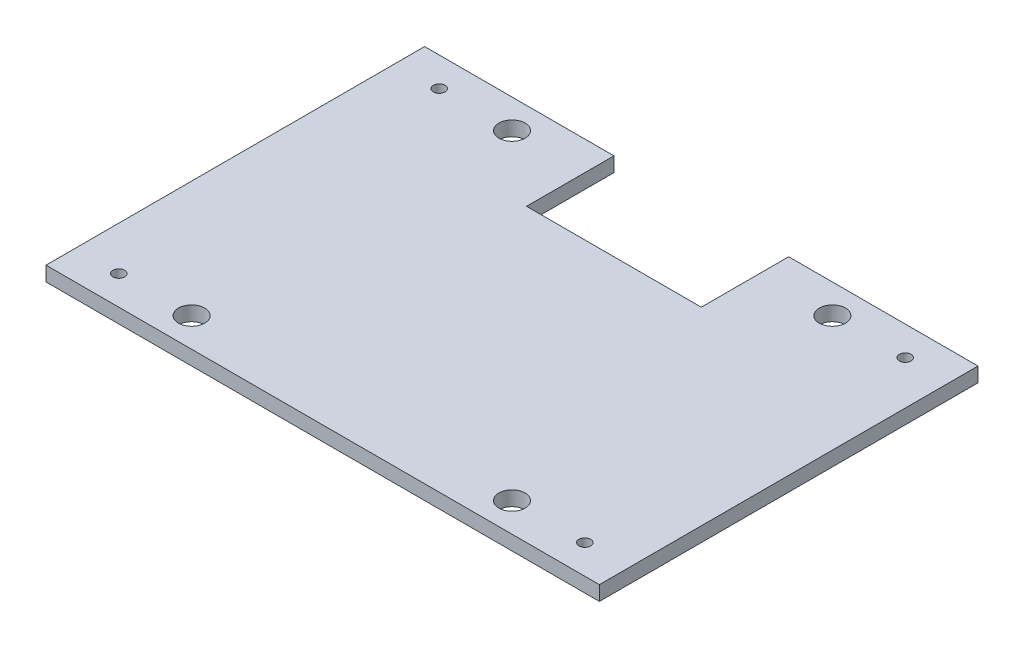
ISO-10303-21;
HEADER;
FILE_DESCRIPTION(('STEP AP214'),'2;1');
FILE_NAME('part.step','',(''),(''),'','','');
FILE_SCHEMA(('AUTOMOTIVE_DESIGN { 1 0 10303 214 1 1 1 1 }'));
ENDSEC;
DATA;
#1=APPLICATION_CONTEXT('core data for automotive mechanical design processes');
#2=APPLICATION_PROTOCOL_DEFINITION('international standard','automotive_design',2000,#1);
#3=PRODUCT_CONTEXT('',#1,'mechanical');
#4=PRODUCT('Part','Part','',(#3));
#5=PRODUCT_RELATED_PRODUCT_CATEGORY('part','',(#4));
#6=PRODUCT_DEFINITION_FORMATION('','',#4);
#7=PRODUCT_DEFINITION_CONTEXT('part definition',#1,'design');
#8=PRODUCT_DEFINITION('design','',#6,#7);
#9=PRODUCT_DEFINITION_SHAPE('','',#8);
#10=(LENGTH_UNIT() NAMED_UNIT(*) SI_UNIT(.MILLI.,.METRE.));
#11=(NAMED_UNIT(*) PLANE_ANGLE_UNIT() SI_UNIT($,.RADIAN.));
#12=(NAMED_UNIT(*) SI_UNIT($,.STERADIAN.) SOLID_ANGLE_UNIT());
#13=UNCERTAINTY_MEASURE_WITH_UNIT(LENGTH_MEASURE(1.E-05),#10,'distance_accuracy_value','');
#14=(GEOMETRIC_REPRESENTATION_CONTEXT(3) GLOBAL_UNCERTAINTY_ASSIGNED_CONTEXT((#13)) GLOBAL_UNIT_ASSIGNED_CONTEXT((#10,
#11,#12)) REPRESENTATION_CONTEXT('',''));
#15=CARTESIAN_POINT('',(0.,0.,0.));
#16=DIRECTION('',(0.,0.,1.));
#17=DIRECTION('',(1.,0.,0.));
#18=AXIS2_PLACEMENT_3D('',#15,#16,#17);
#19=CARTESIAN_POINT('',(0.,5.,0.));
#20=DIRECTION('',(0.,1.,0.));
#21=DIRECTION('',(0.,0.,1.));
#22=AXIS2_PLACEMENT_3D('',#19,#20,#21);
#23=PLANE('',#22);
#24=CARTESIAN_POINT('',(80.,5.,55.));
#25=DIRECTION('',(0.,1.,0.));
#26=DIRECTION('',(0.,0.,1.));
#27=AXIS2_PLACEMENT_3D('',#24,#25,#26);
#28=CIRCLE('',#27,2.);
#29=CARTESIAN_POINT('',(80.,5.,57.));
#30=VERTEX_POINT('',#29);
#31=EDGE_CURVE('E213',#30,#30,#28,.T.);
#32=ORIENTED_EDGE('',*,*,#31,.F.);
#33=EDGE_LOOP('',(#32));
#34=FACE_BOUND('',#33,.T.);
#35=CARTESIAN_POINT('',(-80.,5.,-55.));
#36=DIRECTION('',(0.,1.,0.));
#37=DIRECTION('',(0.,0.,1.));
#38=AXIS2_PLACEMENT_3D('',#35,#36,#37);
#39=CIRCLE('',#38,2.);
#40=CARTESIAN_POINT('',(-80.,5.,-53.));
#41=VERTEX_POINT('',#40);
#42=EDGE_CURVE('E201',#41,#41,#39,.T.);
#43=ORIENTED_EDGE('',*,*,#42,.F.);
#44=EDGE_LOOP('',(#43));
#45=FACE_BOUND('',#44,.T.);
#46=CARTESIAN_POINT('',(55.,5.,55.));
#47=DIRECTION('',(0.,1.,0.));
#48=DIRECTION('',(0.,0.,1.));
#49=AXIS2_PLACEMENT_3D('',#46,#47,#48);
#50=CIRCLE('',#49,4.5);
#51=CARTESIAN_POINT('',(55.,5.,59.5));
#52=VERTEX_POINT('',#51);
#53=EDGE_CURVE('E189',#52,#52,#50,.T.);
#54=ORIENTED_EDGE('',*,*,#53,.F.);
#55=EDGE_LOOP('',(#54));
#56=FACE_BOUND('',#55,.T.);
#57=CARTESIAN_POINT('',(-55.,5.,-55.));
#58=DIRECTION('',(0.,1.,0.));
#59=DIRECTION('',(0.,0.,1.));
#60=AXIS2_PLACEMENT_3D('',#57,#58,#59);
#61=CIRCLE('',#60,4.5);
#62=CARTESIAN_POINT('',(-55.,5.,-50.5));
#63=VERTEX_POINT('',#62);
#64=EDGE_CURVE('E135',#63,#63,#61,.T.);
#65=ORIENTED_EDGE('',*,*,#64,.F.);
#66=EDGE_LOOP('',(#65));
#67=FACE_BOUND('',#66,.T.);
#68=DIRECTION('',(0.,0.,-1.));
#69=VECTOR('',#68,1.);
#70=CARTESIAN_POINT('',(-30.,5.,-65.));
#71=LINE('',#70,#69);
#72=CARTESIAN_POINT('',(-30.,5.,-35.));
#73=VERTEX_POINT('',#72);
#74=CARTESIAN_POINT('',(-30.,5.,-65.));
#75=VERTEX_POINT('',#74);
#76=EDGE_CURVE('E146',#73,#75,#71,.T.);
#77=ORIENTED_EDGE('',*,*,#76,.T.);
#78=DIRECTION('',(-1.,0.,0.));
#79=VECTOR('',#78,1.);
#80=CARTESIAN_POINT('',(-95.,5.,-65.));
#81=LINE('',#80,#79);
#82=CARTESIAN_POINT('',(-95.,5.,-65.));
#83=VERTEX_POINT('',#82);
#84=EDGE_CURVE('E94',#75,#83,#81,.T.);
#85=ORIENTED_EDGE('',*,*,#84,.T.);
#86=DIRECTION('',(0.,0.,1.));
#87=VECTOR('',#86,1.);
#88=CARTESIAN_POINT('',(-95.,5.,-65.));
#89=LINE('',#88,#87);
#90=CARTESIAN_POINT('',(-95.,5.,65.));
#91=VERTEX_POINT('',#90);
#92=EDGE_CURVE('E161',#83,#91,#89,.T.);
#93=ORIENTED_EDGE('',*,*,#92,.T.);
#94=DIRECTION('',(1.,0.,0.));
#95=VECTOR('',#94,1.);
#96=CARTESIAN_POINT('',(-95.,5.,65.));
#97=LINE('',#96,#95);
#98=CARTESIAN_POINT('',(95.,5.,65.));
#99=VERTEX_POINT('',#98);
#100=EDGE_CURVE('E174',#91,#99,#97,.T.);
#101=ORIENTED_EDGE('',*,*,#100,.T.);
#102=DIRECTION('',(0.,0.,-1.));
#103=VECTOR('',#102,1.);
#104=CARTESIAN_POINT('',(95.,5.,-65.));
#105=LINE('',#104,#103);
#106=CARTESIAN_POINT('',(95.,5.,-65.));
#107=VERTEX_POINT('',#106);
#108=EDGE_CURVE('E113',#99,#107,#105,.T.);
#109=ORIENTED_EDGE('',*,*,#108,.T.);
#110=DIRECTION('',(-1.,0.,0.));
#111=VECTOR('',#110,1.);
#112=CARTESIAN_POINT('',(30.,5.,-65.));
#113=LINE('',#112,#111);
#114=CARTESIAN_POINT('',(30.,5.,-65.));
#115=VERTEX_POINT('',#114);
#116=EDGE_CURVE('E107',#107,#115,#113,.T.);
#117=ORIENTED_EDGE('',*,*,#116,.T.);
#118=DIRECTION('',(0.,0.,1.));
#119=VECTOR('',#118,1.);
#120=CARTESIAN_POINT('',(30.,5.,-65.));
#121=LINE('',#120,#119);
#122=CARTESIAN_POINT('',(30.,5.,-35.));
#123=VERTEX_POINT('',#122);
#124=EDGE_CURVE('E111',#115,#123,#121,.T.);
#125=ORIENTED_EDGE('',*,*,#124,.T.);
#126=DIRECTION('',(-1.,0.,0.));
#127=VECTOR('',#126,1.);
#128=CARTESIAN_POINT('',(-30.,5.,-35.));
#129=LINE('',#128,#127);
#130=EDGE_CURVE('E51',#123,#73,#129,.T.);
#131=ORIENTED_EDGE('',*,*,#130,.T.);
#132=EDGE_LOOP('',(#77,#85,#93,#101,#109,#117,#125,#131));
#133=FACE_BOUND('',#132,.T.);
#134=CARTESIAN_POINT('',(55.,5.,-55.));
#135=DIRECTION('',(0.,1.,0.));
#136=DIRECTION('',(0.,0.,-1.));
#137=AXIS2_PLACEMENT_3D('',#134,#135,#136);
#138=CIRCLE('',#137,4.5);
#139=CARTESIAN_POINT('',(55.,5.,-59.5));
#140=VERTEX_POINT('',#139);
#141=EDGE_CURVE('E183',#140,#140,#138,.T.);
#142=ORIENTED_EDGE('',*,*,#141,.F.);
#143=EDGE_LOOP('',(#142));
#144=FACE_BOUND('',#143,.T.);
#145=CARTESIAN_POINT('',(-55.,5.,55.));
#146=DIRECTION('',(0.,1.,0.));
#147=DIRECTION('',(0.,0.,-1.));
#148=AXIS2_PLACEMENT_3D('',#145,#146,#147);
#149=CIRCLE('',#148,4.5);
#150=CARTESIAN_POINT('',(-55.,5.,50.5));
#151=VERTEX_POINT('',#150);
#152=EDGE_CURVE('E195',#151,#151,#149,.T.);
#153=ORIENTED_EDGE('',*,*,#152,.F.);
#154=EDGE_LOOP('',(#153));
#155=FACE_BOUND('',#154,.T.);
#156=CARTESIAN_POINT('',(-80.,5.,55.));
#157=DIRECTION('',(0.,1.,0.));
#158=DIRECTION('',(0.,0.,-1.));
#159=AXIS2_PLACEMENT_3D('',#156,#157,#158);
#160=CIRCLE('',#159,2.);
#161=CARTESIAN_POINT('',(-80.,5.,53.));
#162=VERTEX_POINT('',#161);
#163=EDGE_CURVE('E207',#162,#162,#160,.T.);
#164=ORIENTED_EDGE('',*,*,#163,.F.);
#165=EDGE_LOOP('',(#164));
#166=FACE_BOUND('',#165,.T.);
#167=CARTESIAN_POINT('',(80.,5.,-55.));
#168=DIRECTION('',(0.,1.,0.));
#169=DIRECTION('',(0.,0.,-1.));
#170=AXIS2_PLACEMENT_3D('',#167,#168,#169);
#171=CIRCLE('',#170,2.);
#172=CARTESIAN_POINT('',(80.,5.,-57.));
#173=VERTEX_POINT('',#172);
#174=EDGE_CURVE('E219',#173,#173,#171,.T.);
#175=ORIENTED_EDGE('',*,*,#174,.F.);
#176=EDGE_LOOP('',(#175));
#177=FACE_BOUND('',#176,.T.);
#178=ADVANCED_FACE('F34',(#34,#45,#56,#67,#133,#144,#155,#166,#177),#23,.T.);
#179=CARTESIAN_POINT('',(0.,0.,0.));
#180=DIRECTION('',(0.,1.,0.));
#181=DIRECTION('',(0.,0.,1.));
#182=AXIS2_PLACEMENT_3D('',#179,#180,#181);
#183=PLANE('',#182);
#184=DIRECTION('',(0.,0.,-1.));
#185=VECTOR('',#184,1.);
#186=CARTESIAN_POINT('',(-30.,0.,-65.));
#187=LINE('',#186,#185);
#188=CARTESIAN_POINT('',(-30.,0.,-35.));
#189=VERTEX_POINT('',#188);
#190=CARTESIAN_POINT('',(-30.,0.,-65.));
#191=VERTEX_POINT('',#190);
#192=EDGE_CURVE('E131',#189,#191,#187,.T.);
#193=ORIENTED_EDGE('',*,*,#192,.F.);
#194=DIRECTION('',(-1.,0.,0.));
#195=VECTOR('',#194,1.);
#196=CARTESIAN_POINT('',(-30.,0.,-35.));
#197=LINE('',#196,#195);
#198=CARTESIAN_POINT('',(30.,0.,-35.));
#199=VERTEX_POINT('',#198);
#200=EDGE_CURVE('E86',#199,#189,#197,.T.);
#201=ORIENTED_EDGE('',*,*,#200,.F.);
#202=DIRECTION('',(0.,0.,1.));
#203=VECTOR('',#202,1.);
#204=CARTESIAN_POINT('',(30.,0.,-65.));
#205=LINE('',#204,#203);
#206=CARTESIAN_POINT('',(30.,0.,-65.));
#207=VERTEX_POINT('',#206);
#208=EDGE_CURVE('E80',#207,#199,#205,.T.);
#209=ORIENTED_EDGE('',*,*,#208,.F.);
#210=DIRECTION('',(-1.,0.,0.));
#211=VECTOR('',#210,1.);
#212=CARTESIAN_POINT('',(30.,0.,-65.));
#213=LINE('',#212,#211);
#214=CARTESIAN_POINT('',(95.,0.,-65.));
#215=VERTEX_POINT('',#214);
#216=EDGE_CURVE('E121',#215,#207,#213,.T.);
#217=ORIENTED_EDGE('',*,*,#216,.F.);
#218=DIRECTION('',(0.,0.,-1.));
#219=VECTOR('',#218,1.);
#220=CARTESIAN_POINT('',(95.,0.,-65.));
#221=LINE('',#220,#219);
#222=CARTESIAN_POINT('',(95.,0.,65.));
#223=VERTEX_POINT('',#222);
#224=EDGE_CURVE('E141',#223,#215,#221,.T.);
#225=ORIENTED_EDGE('',*,*,#224,.F.);
#226=DIRECTION('',(1.,0.,0.));
#227=VECTOR('',#226,1.);
#228=CARTESIAN_POINT('',(-95.,0.,65.));
#229=LINE('',#228,#227);
#230=CARTESIAN_POINT('',(-95.,0.,65.));
#231=VERTEX_POINT('',#230);
#232=EDGE_CURVE('E139',#231,#223,#229,.T.);
#233=ORIENTED_EDGE('',*,*,#232,.F.);
#234=DIRECTION('',(0.,0.,1.));
#235=VECTOR('',#234,1.);
#236=CARTESIAN_POINT('',(-95.,0.,-65.));
#237=LINE('',#236,#235);
#238=CARTESIAN_POINT('',(-95.,0.,-65.));
#239=VERTEX_POINT('',#238);
#240=EDGE_CURVE('E137',#239,#231,#237,.T.);
#241=ORIENTED_EDGE('',*,*,#240,.F.);
#242=DIRECTION('',(-1.,0.,0.));
#243=VECTOR('',#242,1.);
#244=CARTESIAN_POINT('',(-95.,0.,-65.));
#245=LINE('',#244,#243);
#246=EDGE_CURVE('E134',#191,#239,#245,.T.);
#247=ORIENTED_EDGE('',*,*,#246,.F.);
#248=EDGE_LOOP('',(#193,#201,#209,#217,#225,#233,#241,#247));
#249=FACE_BOUND('',#248,.T.);
#250=CARTESIAN_POINT('',(-55.,0.,-55.));
#251=DIRECTION('',(0.,1.,0.));
#252=DIRECTION('',(0.,0.,1.));
#253=AXIS2_PLACEMENT_3D('',#250,#251,#252);
#254=CIRCLE('',#253,4.5);
#255=CARTESIAN_POINT('',(-55.,0.,-50.5));
#256=VERTEX_POINT('',#255);
#257=EDGE_CURVE('E180',#256,#256,#254,.T.);
#258=ORIENTED_EDGE('',*,*,#257,.T.);
#259=EDGE_LOOP('',(#258));
#260=FACE_BOUND('',#259,.T.);
#261=CARTESIAN_POINT('',(55.,0.,-55.));
#262=DIRECTION('',(0.,1.,0.));
#263=DIRECTION('',(0.,0.,-1.));
#264=AXIS2_PLACEMENT_3D('',#261,#262,#263);
#265=CIRCLE('',#264,4.5);
#266=CARTESIAN_POINT('',(55.,0.,-59.5));
#267=VERTEX_POINT('',#266);
#268=EDGE_CURVE('E186',#267,#267,#265,.T.);
#269=ORIENTED_EDGE('',*,*,#268,.T.);
#270=EDGE_LOOP('',(#269));
#271=FACE_BOUND('',#270,.T.);
#272=CARTESIAN_POINT('',(55.,0.,55.));
#273=DIRECTION('',(0.,1.,0.));
#274=DIRECTION('',(0.,0.,1.));
#275=AXIS2_PLACEMENT_3D('',#272,#273,#274);
#276=CIRCLE('',#275,4.5);
#277=CARTESIAN_POINT('',(55.,0.,59.5));
#278=VERTEX_POINT('',#277);
#279=EDGE_CURVE('E192',#278,#278,#276,.T.);
#280=ORIENTED_EDGE('',*,*,#279,.T.);
#281=EDGE_LOOP('',(#280));
#282=FACE_BOUND('',#281,.T.);
#283=CARTESIAN_POINT('',(-55.,0.,55.));
#284=DIRECTION('',(0.,1.,0.));
#285=DIRECTION('',(0.,0.,-1.));
#286=AXIS2_PLACEMENT_3D('',#283,#284,#285);
#287=CIRCLE('',#286,4.5);
#288=CARTESIAN_POINT('',(-55.,0.,50.5));
#289=VERTEX_POINT('',#288);
#290=EDGE_CURVE('E198',#289,#289,#287,.T.);
#291=ORIENTED_EDGE('',*,*,#290,.T.);
#292=EDGE_LOOP('',(#291));
#293=FACE_BOUND('',#292,.T.);
#294=CARTESIAN_POINT('',(-80.,0.,-55.));
#295=DIRECTION('',(0.,1.,0.));
#296=DIRECTION('',(0.,0.,1.));
#297=AXIS2_PLACEMENT_3D('',#294,#295,#296);
#298=CIRCLE('',#297,2.);
#299=CARTESIAN_POINT('',(-80.,0.,-53.));
#300=VERTEX_POINT('',#299);
#301=EDGE_CURVE('E204',#300,#300,#298,.T.);
#302=ORIENTED_EDGE('',*,*,#301,.T.);
#303=EDGE_LOOP('',(#302));
#304=FACE_BOUND('',#303,.T.);
#305=CARTESIAN_POINT('',(-80.,0.,55.));
#306=DIRECTION('',(0.,1.,0.));
#307=DIRECTION('',(0.,0.,-1.));
#308=AXIS2_PLACEMENT_3D('',#305,#306,#307);
#309=CIRCLE('',#308,2.);
#310=CARTESIAN_POINT('',(-80.,0.,53.));
#311=VERTEX_POINT('',#310);
#312=EDGE_CURVE('E210',#311,#311,#309,.T.);
#313=ORIENTED_EDGE('',*,*,#312,.T.);
#314=EDGE_LOOP('',(#313));
#315=FACE_BOUND('',#314,.T.);
#316=CARTESIAN_POINT('',(80.,0.,55.));
#317=DIRECTION('',(0.,1.,0.));
#318=DIRECTION('',(0.,0.,1.));
#319=AXIS2_PLACEMENT_3D('',#316,#317,#318);
#320=CIRCLE('',#319,2.);
#321=CARTESIAN_POINT('',(80.,0.,57.));
#322=VERTEX_POINT('',#321);
#323=EDGE_CURVE('E216',#322,#322,#320,.T.);
#324=ORIENTED_EDGE('',*,*,#323,.T.);
#325=EDGE_LOOP('',(#324));
#326=FACE_BOUND('',#325,.T.);
#327=CARTESIAN_POINT('',(80.,0.,-55.));
#328=DIRECTION('',(0.,1.,0.));
#329=DIRECTION('',(0.,0.,-1.));
#330=AXIS2_PLACEMENT_3D('',#327,#328,#329);
#331=CIRCLE('',#330,2.);
#332=CARTESIAN_POINT('',(80.,0.,-57.));
#333=VERTEX_POINT('',#332);
#334=EDGE_CURVE('E222',#333,#333,#331,.T.);
#335=ORIENTED_EDGE('',*,*,#334,.T.);
#336=EDGE_LOOP('',(#335));
#337=FACE_BOUND('',#336,.T.);
#338=ADVANCED_FACE('F165',(#249,#260,#271,#282,#293,#304,#315,#326,#337),#183,.F.);
#339=CARTESIAN_POINT('',(-30.,5.,-65.));
#340=DIRECTION('',(-1.,0.,0.));
#341=DIRECTION('',(0.,0.,1.));
#342=AXIS2_PLACEMENT_3D('',#339,#340,#341);
#343=PLANE('',#342);
#344=ORIENTED_EDGE('',*,*,#192,.T.);
#345=DIRECTION('',(0.,-1.,0.));
#346=VECTOR('',#345,1.);
#347=CARTESIAN_POINT('',(-30.,5.,-65.));
#348=LINE('',#347,#346);
#349=EDGE_CURVE('E11',#75,#191,#348,.T.);
#350=ORIENTED_EDGE('',*,*,#349,.F.);
#351=ORIENTED_EDGE('',*,*,#76,.F.);
#352=DIRECTION('',(0.,-1.,0.));
#353=VECTOR('',#352,1.);
#354=CARTESIAN_POINT('',(-30.,5.,-35.));
#355=LINE('',#354,#353);
#356=EDGE_CURVE('E127',#73,#189,#355,.T.);
#357=ORIENTED_EDGE('',*,*,#356,.T.);
#358=EDGE_LOOP('',(#344,#350,#351,#357));
#359=FACE_BOUND('',#358,.T.);
#360=ADVANCED_FACE('F36',(#359),#343,.F.);
#361=CARTESIAN_POINT('',(-95.,5.,-65.));
#362=DIRECTION('',(0.,0.,1.));
#363=DIRECTION('',(1.,0.,0.));
#364=AXIS2_PLACEMENT_3D('',#361,#362,#363);
#365=PLANE('',#364);
#366=ORIENTED_EDGE('',*,*,#246,.T.);
#367=DIRECTION('',(0.,-1.,0.));
#368=VECTOR('',#367,1.);
#369=CARTESIAN_POINT('',(-95.,5.,-65.));
#370=LINE('',#369,#368);
#371=EDGE_CURVE('E43',#83,#239,#370,.T.);
#372=ORIENTED_EDGE('',*,*,#371,.F.);
#373=ORIENTED_EDGE('',*,*,#84,.F.);
#374=ORIENTED_EDGE('',*,*,#349,.T.);
#375=EDGE_LOOP('',(#366,#372,#373,#374));
#376=FACE_BOUND('',#375,.T.);
#377=ADVANCED_FACE('F256',(#376),#365,.F.);
#378=CARTESIAN_POINT('',(-95.,5.,-65.));
#379=DIRECTION('',(1.,0.,0.));
#380=DIRECTION('',(0.,0.,-1.));
#381=AXIS2_PLACEMENT_3D('',#378,#379,#380);
#382=PLANE('',#381);
#383=ORIENTED_EDGE('',*,*,#240,.T.);
#384=DIRECTION('',(0.,-1.,0.));
#385=VECTOR('',#384,1.);
#386=CARTESIAN_POINT('',(-95.,5.,65.));
#387=LINE('',#386,#385);
#388=EDGE_CURVE('E153',#91,#231,#387,.T.);
#389=ORIENTED_EDGE('',*,*,#388,.F.);
#390=ORIENTED_EDGE('',*,*,#92,.F.);
#391=ORIENTED_EDGE('',*,*,#371,.T.);
#392=EDGE_LOOP('',(#383,#389,#390,#391));
#393=FACE_BOUND('',#392,.T.);
#394=ADVANCED_FACE('F159',(#393),#382,.F.);
#395=CARTESIAN_POINT('',(-95.,5.,65.));
#396=DIRECTION('',(0.,0.,-1.));
#397=DIRECTION('',(-1.,0.,0.));
#398=AXIS2_PLACEMENT_3D('',#395,#396,#397);
#399=PLANE('',#398);
#400=ORIENTED_EDGE('',*,*,#232,.T.);
#401=DIRECTION('',(0.,-1.,0.));
#402=VECTOR('',#401,1.);
#403=CARTESIAN_POINT('',(95.,5.,65.));
#404=LINE('',#403,#402);
#405=EDGE_CURVE('E150',#99,#223,#404,.T.);
#406=ORIENTED_EDGE('',*,*,#405,.F.);
#407=ORIENTED_EDGE('',*,*,#100,.F.);
#408=ORIENTED_EDGE('',*,*,#388,.T.);
#409=EDGE_LOOP('',(#400,#406,#407,#408));
#410=FACE_BOUND('',#409,.T.);
#411=ADVANCED_FACE('F170',(#410),#399,.F.);
#412=CARTESIAN_POINT('',(95.,5.,-65.));
#413=DIRECTION('',(-1.,0.,0.));
#414=DIRECTION('',(0.,0.,1.));
#415=AXIS2_PLACEMENT_3D('',#412,#413,#414);
#416=PLANE('',#415);
#417=ORIENTED_EDGE('',*,*,#224,.T.);
#418=DIRECTION('',(0.,-1.,0.));
#419=VECTOR('',#418,1.);
#420=CARTESIAN_POINT('',(95.,5.,-65.));
#421=LINE('',#420,#419);
#422=EDGE_CURVE('E122',#107,#215,#421,.T.);
#423=ORIENTED_EDGE('',*,*,#422,.F.);
#424=ORIENTED_EDGE('',*,*,#108,.F.);
#425=ORIENTED_EDGE('',*,*,#405,.T.);
#426=EDGE_LOOP('',(#417,#423,#424,#425));
#427=FACE_BOUND('',#426,.T.);
#428=ADVANCED_FACE('F173',(#427),#416,.F.);
#429=CARTESIAN_POINT('',(30.,5.,-65.));
#430=DIRECTION('',(0.,0.,1.));
#431=DIRECTION('',(1.,0.,0.));
#432=AXIS2_PLACEMENT_3D('',#429,#430,#431);
#433=PLANE('',#432);
#434=ORIENTED_EDGE('',*,*,#216,.T.);
#435=DIRECTION('',(0.,-1.,0.));
#436=VECTOR('',#435,1.);
#437=CARTESIAN_POINT('',(30.,5.,-65.));
#438=LINE('',#437,#436);
#439=EDGE_CURVE('E118',#115,#207,#438,.T.);
#440=ORIENTED_EDGE('',*,*,#439,.F.);
#441=ORIENTED_EDGE('',*,*,#116,.F.);
#442=ORIENTED_EDGE('',*,*,#422,.T.);
#443=EDGE_LOOP('',(#434,#440,#441,#442));
#444=FACE_BOUND('',#443,.T.);
#445=ADVANCED_FACE('F119',(#444),#433,.F.);
#446=CARTESIAN_POINT('',(30.,5.,-65.));
#447=DIRECTION('',(1.,0.,0.));
#448=DIRECTION('',(0.,0.,-1.));
#449=AXIS2_PLACEMENT_3D('',#446,#447,#448);
#450=PLANE('',#449);
#451=ORIENTED_EDGE('',*,*,#208,.T.);
#452=DIRECTION('',(0.,-1.,0.));
#453=VECTOR('',#452,1.);
#454=CARTESIAN_POINT('',(30.,5.,-35.));
#455=LINE('',#454,#453);
#456=EDGE_CURVE('E123',#123,#199,#455,.T.);
#457=ORIENTED_EDGE('',*,*,#456,.F.);
#458=ORIENTED_EDGE('',*,*,#124,.F.);
#459=ORIENTED_EDGE('',*,*,#439,.T.);
#460=EDGE_LOOP('',(#451,#457,#458,#459));
#461=FACE_BOUND('',#460,.T.);
#462=ADVANCED_FACE('F125',(#461),#450,.F.);
#463=CARTESIAN_POINT('',(-30.,5.,-35.));
#464=DIRECTION('',(0.,0.,1.));
#465=DIRECTION('',(1.,0.,0.));
#466=AXIS2_PLACEMENT_3D('',#463,#464,#465);
#467=PLANE('',#466);
#468=ORIENTED_EDGE('',*,*,#200,.T.);
#469=ORIENTED_EDGE('',*,*,#356,.F.);
#470=ORIENTED_EDGE('',*,*,#130,.F.);
#471=ORIENTED_EDGE('',*,*,#456,.T.);
#472=EDGE_LOOP('',(#468,#469,#470,#471));
#473=FACE_BOUND('',#472,.T.);
#474=ADVANCED_FACE('F244',(#473),#467,.F.);
#475=CARTESIAN_POINT('',(-55.,5.,-55.));
#476=DIRECTION('',(0.,-1.,0.));
#477=DIRECTION('',(0.,0.,-1.));
#478=AXIS2_PLACEMENT_3D('',#475,#476,#477);
#479=CYLINDRICAL_SURFACE('',#478,4.5);
#480=ORIENTED_EDGE('',*,*,#64,.T.);
#481=EDGE_LOOP('',(#480));
#482=FACE_BOUND('',#481,.T.);
#483=ORIENTED_EDGE('',*,*,#257,.F.);
#484=EDGE_LOOP('',(#483));
#485=FACE_BOUND('',#484,.T.);
#486=ADVANCED_FACE('F241',(#482,#485),#479,.F.);
#487=CARTESIAN_POINT('',(55.,5.,-55.));
#488=DIRECTION('',(0.,-1.,0.));
#489=DIRECTION('',(0.,0.,-1.));
#490=AXIS2_PLACEMENT_3D('',#487,#488,#489);
#491=CYLINDRICAL_SURFACE('',#490,4.5);
#492=ORIENTED_EDGE('',*,*,#141,.T.);
#493=EDGE_LOOP('',(#492));
#494=FACE_BOUND('',#493,.T.);
#495=ORIENTED_EDGE('',*,*,#268,.F.);
#496=EDGE_LOOP('',(#495));
#497=FACE_BOUND('',#496,.T.);
#498=ADVANCED_FACE('F320',(#494,#497),#491,.F.);
#499=CARTESIAN_POINT('',(55.,5.,55.));
#500=DIRECTION('',(0.,-1.,0.));
#501=DIRECTION('',(0.,0.,-1.));
#502=AXIS2_PLACEMENT_3D('',#499,#500,#501);
#503=CYLINDRICAL_SURFACE('',#502,4.5);
#504=ORIENTED_EDGE('',*,*,#53,.T.);
#505=EDGE_LOOP('',(#504));
#506=FACE_BOUND('',#505,.T.);
#507=ORIENTED_EDGE('',*,*,#279,.F.);
#508=EDGE_LOOP('',(#507));
#509=FACE_BOUND('',#508,.T.);
#510=ADVANCED_FACE('F328',(#506,#509),#503,.F.);
#511=CARTESIAN_POINT('',(-55.,5.,55.));
#512=DIRECTION('',(0.,-1.,0.));
#513=DIRECTION('',(0.,0.,-1.));
#514=AXIS2_PLACEMENT_3D('',#511,#512,#513);
#515=CYLINDRICAL_SURFACE('',#514,4.5);
#516=ORIENTED_EDGE('',*,*,#152,.T.);
#517=EDGE_LOOP('',(#516));
#518=FACE_BOUND('',#517,.T.);
#519=ORIENTED_EDGE('',*,*,#290,.F.);
#520=EDGE_LOOP('',(#519));
#521=FACE_BOUND('',#520,.T.);
#522=ADVANCED_FACE('F336',(#518,#521),#515,.F.);
#523=CARTESIAN_POINT('',(-80.,5.,-55.));
#524=DIRECTION('',(0.,-1.,0.));
#525=DIRECTION('',(0.,0.,-1.));
#526=AXIS2_PLACEMENT_3D('',#523,#524,#525);
#527=CYLINDRICAL_SURFACE('',#526,2.);
#528=ORIENTED_EDGE('',*,*,#42,.T.);
#529=EDGE_LOOP('',(#528));
#530=FACE_BOUND('',#529,.T.);
#531=ORIENTED_EDGE('',*,*,#301,.F.);
#532=EDGE_LOOP('',(#531));
#533=FACE_BOUND('',#532,.T.);
#534=ADVANCED_FACE('F345',(#530,#533),#527,.F.);
#535=CARTESIAN_POINT('',(-80.,5.,55.));
#536=DIRECTION('',(0.,-1.,0.));
#537=DIRECTION('',(0.,0.,-1.));
#538=AXIS2_PLACEMENT_3D('',#535,#536,#537);
#539=CYLINDRICAL_SURFACE('',#538,2.);
#540=ORIENTED_EDGE('',*,*,#163,.T.);
#541=EDGE_LOOP('',(#540));
#542=FACE_BOUND('',#541,.T.);
#543=ORIENTED_EDGE('',*,*,#312,.F.);
#544=EDGE_LOOP('',(#543));
#545=FACE_BOUND('',#544,.T.);
#546=ADVANCED_FACE('F354',(#542,#545),#539,.F.);
#547=CARTESIAN_POINT('',(80.,5.,55.));
#548=DIRECTION('',(0.,-1.,0.));
#549=DIRECTION('',(0.,0.,-1.));
#550=AXIS2_PLACEMENT_3D('',#547,#548,#549);
#551=CYLINDRICAL_SURFACE('',#550,2.);
#552=ORIENTED_EDGE('',*,*,#31,.T.);
#553=EDGE_LOOP('',(#552));
#554=FACE_BOUND('',#553,.T.);
#555=ORIENTED_EDGE('',*,*,#323,.F.);
#556=EDGE_LOOP('',(#555));
#557=FACE_BOUND('',#556,.T.);
#558=ADVANCED_FACE('F363',(#554,#557),#551,.F.);
#559=CARTESIAN_POINT('',(80.,5.,-55.));
#560=DIRECTION('',(0.,-1.,0.));
#561=DIRECTION('',(0.,0.,-1.));
#562=AXIS2_PLACEMENT_3D('',#559,#560,#561);
#563=CYLINDRICAL_SURFACE('',#562,2.);
#564=ORIENTED_EDGE('',*,*,#174,.T.);
#565=EDGE_LOOP('',(#564));
#566=FACE_BOUND('',#565,.T.);
#567=ORIENTED_EDGE('',*,*,#334,.F.);
#568=EDGE_LOOP('',(#567));
#569=FACE_BOUND('',#568,.T.);
#570=ADVANCED_FACE('F228',(#566,#569),#563,.F.);
#571=CLOSED_SHELL('',(#178,#338,#360,#377,#394,#411,#428,#445,#462,#474,#486,#498,#510,#522,
#534,#546,#558,#570));
#572=MANIFOLD_SOLID_BREP('B2',#571);
#573=ADVANCED_BREP_SHAPE_REPRESENTATION('',(#18,#572),#14);
#574=SHAPE_DEFINITION_REPRESENTATION(#9,#573);
ENDSEC;
END-ISO-10303-21;
